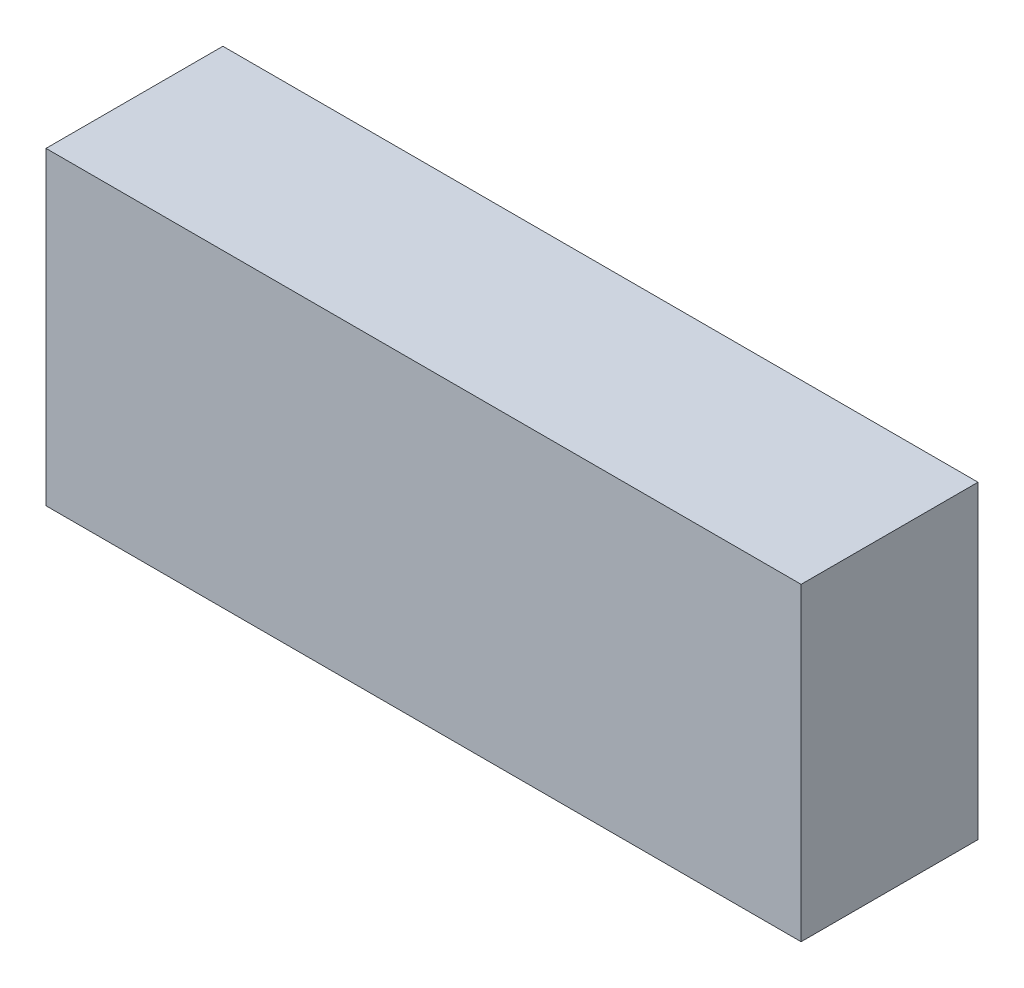
ISO-10303-21;
HEADER;
FILE_DESCRIPTION(('STEP AP214'),'2;1');
FILE_NAME('part.step','',(''),(''),'','','');
FILE_SCHEMA(('AUTOMOTIVE_DESIGN { 1 0 10303 214 1 1 1 1 }'));
ENDSEC;
DATA;
#1=APPLICATION_CONTEXT('core data for automotive mechanical design processes');
#2=APPLICATION_PROTOCOL_DEFINITION('international standard','automotive_design',2000,#1);
#3=PRODUCT_CONTEXT('',#1,'mechanical');
#4=PRODUCT('Part','Part','',(#3));
#5=PRODUCT_RELATED_PRODUCT_CATEGORY('part','',(#4));
#6=PRODUCT_DEFINITION_FORMATION('','',#4);
#7=PRODUCT_DEFINITION_CONTEXT('part definition',#1,'design');
#8=PRODUCT_DEFINITION('design','',#6,#7);
#9=PRODUCT_DEFINITION_SHAPE('','',#8);
#10=(LENGTH_UNIT() NAMED_UNIT(*) SI_UNIT(.MILLI.,.METRE.));
#11=(NAMED_UNIT(*) PLANE_ANGLE_UNIT() SI_UNIT($,.RADIAN.));
#12=(NAMED_UNIT(*) SI_UNIT($,.STERADIAN.) SOLID_ANGLE_UNIT());
#13=UNCERTAINTY_MEASURE_WITH_UNIT(LENGTH_MEASURE(1.E-05),#10,'distance_accuracy_value','');
#14=(GEOMETRIC_REPRESENTATION_CONTEXT(3) GLOBAL_UNCERTAINTY_ASSIGNED_CONTEXT((#13)) GLOBAL_UNIT_ASSIGNED_CONTEXT((#10,
#11,#12)) REPRESENTATION_CONTEXT('',''));
#15=CARTESIAN_POINT('',(0.,0.,0.));
#16=DIRECTION('',(0.,0.,1.));
#17=DIRECTION('',(1.,0.,0.));
#18=AXIS2_PLACEMENT_3D('',#15,#16,#17);
#19=CARTESIAN_POINT('',(0.,7.,-64.9479342261222));
#20=DIRECTION('',(0.,0.,-1.));
#21=DIRECTION('',(-1.,0.,0.));
#22=AXIS2_PLACEMENT_3D('',#19,#20,#21);
#23=PLANE('',#22);
#24=DIRECTION('',(1.,0.,0.));
#25=VECTOR('',#24,1.);
#26=CARTESIAN_POINT('',(0.,0.,-64.9479342261222));
#27=LINE('',#26,#25);
#28=CARTESIAN_POINT('',(122.923864015185,0.,-64.9479342261222));
#29=VERTEX_POINT('',#28);
#30=CARTESIAN_POINT('',(140.,0.,-64.9479342261222));
#31=VERTEX_POINT('',#30);
#32=EDGE_CURVE('E11',#29,#31,#27,.T.);
#33=ORIENTED_EDGE('',*,*,#32,.T.);
#34=DIRECTION('',(0.,-1.,0.));
#35=VECTOR('',#34,1.);
#36=CARTESIAN_POINT('',(140.,7.,-64.9479342261222));
#37=LINE('',#36,#35);
#38=CARTESIAN_POINT('',(140.,7.,-64.9479342261222));
#39=VERTEX_POINT('',#38);
#40=EDGE_CURVE('E113',#39,#31,#37,.T.);
#41=ORIENTED_EDGE('',*,*,#40,.F.);
#42=DIRECTION('',(1.,0.,0.));
#43=VECTOR('',#42,1.);
#44=CARTESIAN_POINT('',(0.,7.,-64.9479342261222));
#45=LINE('',#44,#43);
#46=CARTESIAN_POINT('',(122.923864015185,7.,-64.9479342261222));
#47=VERTEX_POINT('',#46);
#48=EDGE_CURVE('E46',#47,#39,#45,.T.);
#49=ORIENTED_EDGE('',*,*,#48,.F.);
#50=DIRECTION('',(0.,-1.,0.));
#51=VECTOR('',#50,1.);
#52=CARTESIAN_POINT('',(122.923864015185,7.,-64.9479342261222));
#53=LINE('',#52,#51);
#54=EDGE_CURVE('E101',#47,#29,#53,.T.);
#55=ORIENTED_EDGE('',*,*,#54,.T.);
#56=EDGE_LOOP('',(#33,#41,#49,#55));
#57=FACE_BOUND('',#56,.T.);
#58=ADVANCED_FACE('F42',(#57),#23,.F.);
#59=CARTESIAN_POINT('',(140.,7.,0.));
#60=DIRECTION('',(-1.,0.,0.));
#61=DIRECTION('',(0.,0.,1.));
#62=AXIS2_PLACEMENT_3D('',#59,#60,#61);
#63=PLANE('',#62);
#64=DIRECTION('',(0.,0.,-1.));
#65=VECTOR('',#64,1.);
#66=CARTESIAN_POINT('',(140.,0.,0.));
#67=LINE('',#66,#65);
#68=CARTESIAN_POINT('',(140.,0.,-68.9479342261222));
#69=VERTEX_POINT('',#68);
#70=EDGE_CURVE('E52',#31,#69,#67,.T.);
#71=ORIENTED_EDGE('',*,*,#70,.T.);
#72=DIRECTION('',(0.,-1.,0.));
#73=VECTOR('',#72,1.);
#74=CARTESIAN_POINT('',(140.,7.,-68.9479342261222));
#75=LINE('',#74,#73);
#76=CARTESIAN_POINT('',(140.,7.,-68.9479342261222));
#77=VERTEX_POINT('',#76);
#78=EDGE_CURVE('E97',#77,#69,#75,.T.);
#79=ORIENTED_EDGE('',*,*,#78,.F.);
#80=DIRECTION('',(0.,0.,-1.));
#81=VECTOR('',#80,1.);
#82=CARTESIAN_POINT('',(140.,7.,0.));
#83=LINE('',#82,#81);
#84=EDGE_CURVE('E76',#39,#77,#83,.T.);
#85=ORIENTED_EDGE('',*,*,#84,.F.);
#86=ORIENTED_EDGE('',*,*,#40,.T.);
#87=EDGE_LOOP('',(#71,#79,#85,#86));
#88=FACE_BOUND('',#87,.T.);
#89=ADVANCED_FACE('F116',(#88),#63,.F.);
#90=CARTESIAN_POINT('',(0.,7.,-68.9479342261222));
#91=DIRECTION('',(0.,0.,1.));
#92=DIRECTION('',(1.,0.,0.));
#93=AXIS2_PLACEMENT_3D('',#90,#91,#92);
#94=PLANE('',#93);
#95=DIRECTION('',(-1.,0.,0.));
#96=VECTOR('',#95,1.);
#97=CARTESIAN_POINT('',(0.,0.,-68.9479342261222));
#98=LINE('',#97,#96);
#99=CARTESIAN_POINT('',(122.923864015185,0.,-68.9479342261222));
#100=VERTEX_POINT('',#99);
#101=EDGE_CURVE('E92',#69,#100,#98,.T.);
#102=ORIENTED_EDGE('',*,*,#101,.T.);
#103=DIRECTION('',(0.,-1.,0.));
#104=VECTOR('',#103,1.);
#105=CARTESIAN_POINT('',(122.923864015185,7.,-68.9479342261222));
#106=LINE('',#105,#104);
#107=CARTESIAN_POINT('',(122.923864015185,7.,-68.9479342261222));
#108=VERTEX_POINT('',#107);
#109=EDGE_CURVE('E95',#108,#100,#106,.T.);
#110=ORIENTED_EDGE('',*,*,#109,.F.);
#111=DIRECTION('',(-1.,0.,0.));
#112=VECTOR('',#111,1.);
#113=CARTESIAN_POINT('',(0.,7.,-68.9479342261222));
#114=LINE('',#113,#112);
#115=EDGE_CURVE('E109',#77,#108,#114,.T.);
#116=ORIENTED_EDGE('',*,*,#115,.F.);
#117=ORIENTED_EDGE('',*,*,#78,.T.);
#118=EDGE_LOOP('',(#102,#110,#116,#117));
#119=FACE_BOUND('',#118,.T.);
#120=ADVANCED_FACE('F93',(#119),#94,.F.);
#121=CARTESIAN_POINT('',(122.923864015185,7.,0.));
#122=DIRECTION('',(1.,0.,0.));
#123=DIRECTION('',(0.,0.,-1.));
#124=AXIS2_PLACEMENT_3D('',#121,#122,#123);
#125=PLANE('',#124);
#126=DIRECTION('',(0.,0.,1.));
#127=VECTOR('',#126,1.);
#128=CARTESIAN_POINT('',(122.923864015185,0.,0.));
#129=LINE('',#128,#127);
#130=EDGE_CURVE('E86',#100,#29,#129,.T.);
#131=ORIENTED_EDGE('',*,*,#130,.T.);
#132=ORIENTED_EDGE('',*,*,#54,.F.);
#133=DIRECTION('',(0.,0.,1.));
#134=VECTOR('',#133,1.);
#135=CARTESIAN_POINT('',(122.923864015185,7.,0.));
#136=LINE('',#135,#134);
#137=EDGE_CURVE('E100',#108,#47,#136,.T.);
#138=ORIENTED_EDGE('',*,*,#137,.F.);
#139=ORIENTED_EDGE('',*,*,#109,.T.);
#140=EDGE_LOOP('',(#131,#132,#138,#139));
#141=FACE_BOUND('',#140,.T.);
#142=ADVANCED_FACE('F99',(#141),#125,.F.);
#143=CARTESIAN_POINT('',(0.,7.,0.));
#144=DIRECTION('',(0.,1.,0.));
#145=DIRECTION('',(0.,0.,1.));
#146=AXIS2_PLACEMENT_3D('',#143,#144,#145);
#147=PLANE('',#146);
#148=ORIENTED_EDGE('',*,*,#48,.T.);
#149=ORIENTED_EDGE('',*,*,#84,.T.);
#150=ORIENTED_EDGE('',*,*,#115,.T.);
#151=ORIENTED_EDGE('',*,*,#137,.T.);
#152=EDGE_LOOP('',(#148,#149,#150,#151));
#153=FACE_BOUND('',#152,.T.);
#154=ADVANCED_FACE('F44',(#153),#147,.T.);
#155=CARTESIAN_POINT('',(0.,0.,0.));
#156=DIRECTION('',(0.,1.,0.));
#157=DIRECTION('',(0.,0.,1.));
#158=AXIS2_PLACEMENT_3D('',#155,#156,#157);
#159=PLANE('',#158);
#160=ORIENTED_EDGE('',*,*,#32,.F.);
#161=ORIENTED_EDGE('',*,*,#130,.F.);
#162=ORIENTED_EDGE('',*,*,#101,.F.);
#163=ORIENTED_EDGE('',*,*,#70,.F.);
#164=EDGE_LOOP('',(#160,#161,#162,#163));
#165=FACE_BOUND('',#164,.T.);
#166=ADVANCED_FACE('F103',(#165),#159,.F.);
#167=CLOSED_SHELL('',(#58,#89,#120,#142,#154,#166));
#168=MANIFOLD_SOLID_BREP('B2',#167);
#169=ADVANCED_BREP_SHAPE_REPRESENTATION('',(#18,#168),#14);
#170=SHAPE_DEFINITION_REPRESENTATION(#9,#169);
ENDSEC;
END-ISO-10303-21;
